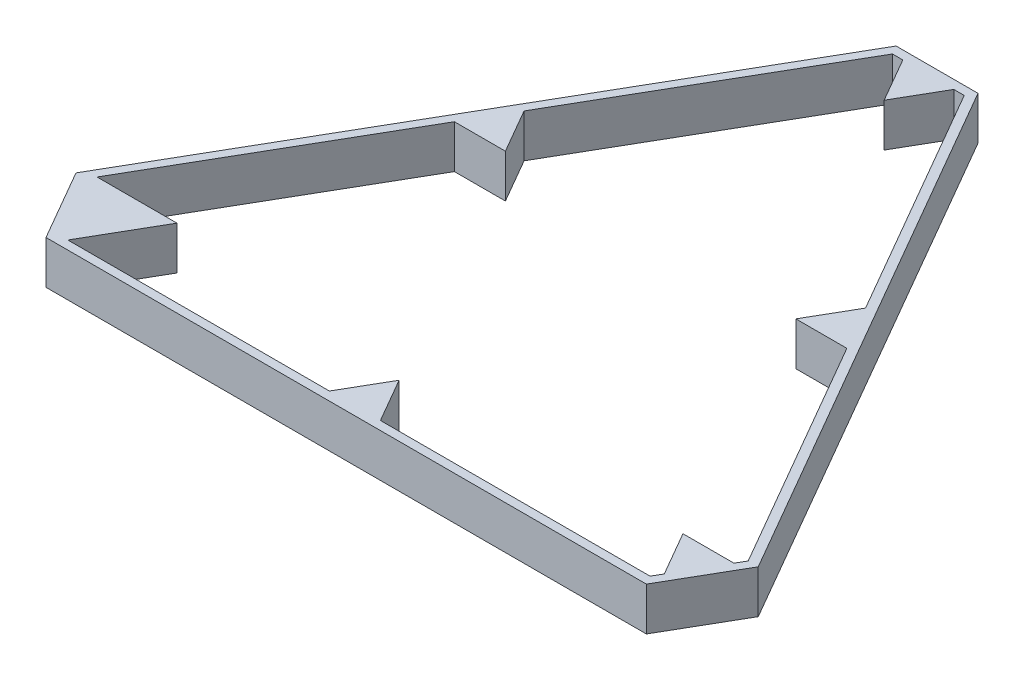
ISO-10303-21;
HEADER;
FILE_DESCRIPTION(('STEP AP214'),'2;1');
FILE_NAME('part.step','',(''),(''),'','','');
FILE_SCHEMA(('AUTOMOTIVE_DESIGN { 1 0 10303 214 1 1 1 1 }'));
ENDSEC;
DATA;
#1=APPLICATION_CONTEXT('core data for automotive mechanical design processes');
#2=APPLICATION_PROTOCOL_DEFINITION('international standard','automotive_design',2000,#1);
#3=PRODUCT_CONTEXT('',#1,'mechanical');
#4=PRODUCT('Part','Part','',(#3));
#5=PRODUCT_RELATED_PRODUCT_CATEGORY('part','',(#4));
#6=PRODUCT_DEFINITION_FORMATION('','',#4);
#7=PRODUCT_DEFINITION_CONTEXT('part definition',#1,'design');
#8=PRODUCT_DEFINITION('design','',#6,#7);
#9=PRODUCT_DEFINITION_SHAPE('','',#8);
#10=(LENGTH_UNIT() NAMED_UNIT(*) SI_UNIT(.MILLI.,.METRE.));
#11=(NAMED_UNIT(*) PLANE_ANGLE_UNIT() SI_UNIT($,.RADIAN.));
#12=(NAMED_UNIT(*) SI_UNIT($,.STERADIAN.) SOLID_ANGLE_UNIT());
#13=UNCERTAINTY_MEASURE_WITH_UNIT(LENGTH_MEASURE(1.E-05),#10,'distance_accuracy_value','');
#14=(GEOMETRIC_REPRESENTATION_CONTEXT(3) GLOBAL_UNCERTAINTY_ASSIGNED_CONTEXT((#13)) GLOBAL_UNIT_ASSIGNED_CONTEXT((#10,
#11,#12)) REPRESENTATION_CONTEXT('',''));
#15=CARTESIAN_POINT('',(0.,0.,0.));
#16=DIRECTION('',(0.,0.,1.));
#17=DIRECTION('',(1.,0.,0.));
#18=AXIS2_PLACEMENT_3D('',#15,#16,#17);
#19=CARTESIAN_POINT('',(-97.7416697506329,12.38,-18.8923048450671));
#20=DIRECTION('',(0.866025403784439,0.,-0.5));
#21=DIRECTION('',(-0.5,0.,-0.866025403784439));
#22=AXIS2_PLACEMENT_3D('',#19,#20,#21);
#23=PLANE('',#22);
#24=DIRECTION('',(0.5,0.,0.866025403784439));
#25=VECTOR('',#24,1.);
#26=CARTESIAN_POINT('',(-97.7416697506329,0.,-18.8923048450671));
#27=LINE('',#26,#25);
#28=CARTESIAN_POINT('',(-97.7416697506329,0.,-18.8923048450671));
#29=VERTEX_POINT('',#28);
#30=CARTESIAN_POINT('',(-86.0096189437243,0.,1.42820322947795));
#31=VERTEX_POINT('',#30);
#32=EDGE_CURVE('E435',#29,#31,#27,.T.);
#33=ORIENTED_EDGE('',*,*,#32,.T.);
#34=DIRECTION('',(0.,-1.,0.));
#35=VECTOR('',#34,1.);
#36=CARTESIAN_POINT('',(-86.0096189437243,12.38,1.42820322947795));
#37=LINE('',#36,#35);
#38=CARTESIAN_POINT('',(-86.0096189437243,12.38,1.42820322947795));
#39=VERTEX_POINT('',#38);
#40=EDGE_CURVE('E12',#39,#31,#37,.T.);
#41=ORIENTED_EDGE('',*,*,#40,.F.);
#42=DIRECTION('',(0.5,0.,0.866025403784439));
#43=VECTOR('',#42,1.);
#44=CARTESIAN_POINT('',(-97.7416697506329,12.38,-18.8923048450671));
#45=LINE('',#44,#43);
#46=CARTESIAN_POINT('',(-97.7416697506329,12.38,-18.8923048450671));
#47=VERTEX_POINT('',#46);
#48=EDGE_CURVE('E475',#47,#39,#45,.T.);
#49=ORIENTED_EDGE('',*,*,#48,.F.);
#50=DIRECTION('',(0.,-1.,0.));
#51=VECTOR('',#50,1.);
#52=CARTESIAN_POINT('',(-97.7416697506329,12.38,-18.8923048450671));
#53=LINE('',#52,#51);
#54=EDGE_CURVE('E492',#47,#29,#53,.T.);
#55=ORIENTED_EDGE('',*,*,#54,.T.);
#56=EDGE_LOOP('',(#33,#41,#49,#55));
#57=FACE_BOUND('',#56,.T.);
#58=ADVANCED_FACE('F117',(#57),#23,.F.);
#59=CARTESIAN_POINT('',(-86.0096189437243,12.38,1.42820322947795));
#60=DIRECTION('',(0.,0.,-1.));
#61=DIRECTION('',(-1.,0.,0.));
#62=AXIS2_PLACEMENT_3D('',#59,#60,#61);
#63=PLANE('',#62);
#64=DIRECTION('',(1.,0.,0.));
#65=VECTOR('',#64,1.);
#66=CARTESIAN_POINT('',(-86.0096189437243,0.,1.42820322947795));
#67=LINE('',#66,#65);
#68=CARTESIAN_POINT('',(86.0096189497081,0.,1.42820322947791));
#69=VERTEX_POINT('',#68);
#70=EDGE_CURVE('E495',#31,#69,#67,.T.);
#71=ORIENTED_EDGE('',*,*,#70,.T.);
#72=DIRECTION('',(0.,-1.,0.));
#73=VECTOR('',#72,1.);
#74=CARTESIAN_POINT('',(86.0096189497081,12.38,1.42820322947791));
#75=LINE('',#74,#73);
#76=CARTESIAN_POINT('',(86.0096189497081,12.38,1.42820322947791));
#77=VERTEX_POINT('',#76);
#78=EDGE_CURVE('E124',#77,#69,#75,.T.);
#79=ORIENTED_EDGE('',*,*,#78,.F.);
#80=DIRECTION('',(1.,0.,0.));
#81=VECTOR('',#80,1.);
#82=CARTESIAN_POINT('',(-86.0096189437243,12.38,1.42820322947795));
#83=LINE('',#82,#81);
#84=EDGE_CURVE('E478',#39,#77,#83,.T.);
#85=ORIENTED_EDGE('',*,*,#84,.F.);
#86=ORIENTED_EDGE('',*,*,#40,.T.);
#87=EDGE_LOOP('',(#71,#79,#85,#86));
#88=FACE_BOUND('',#87,.T.);
#89=ADVANCED_FACE('F521',(#88),#63,.F.);
#90=CARTESIAN_POINT('',(97.7416697477462,12.38,-18.8923048500671));
#91=DIRECTION('',(0.866025404001409,0.,0.499999999624197));
#92=DIRECTION('',(0.499999999624197,0.,-0.866025404001409));
#93=AXIS2_PLACEMENT_3D('',#90,#91,#92);
#94=PLANE('',#93);
#95=DIRECTION('',(-0.499999999624197,0.,0.866025404001409));
#96=VECTOR('',#95,1.);
#97=CARTESIAN_POINT('',(97.7416697477462,0.,-18.8923048500671));
#98=LINE('',#97,#96);
#99=CARTESIAN_POINT('',(97.7416697477462,0.,-18.8923048500671));
#100=VERTEX_POINT('',#99);
#101=EDGE_CURVE('E498',#100,#69,#98,.T.);
#102=ORIENTED_EDGE('',*,*,#101,.F.);
#103=DIRECTION('',(0.,-1.,0.));
#104=VECTOR('',#103,1.);
#105=CARTESIAN_POINT('',(97.7416697477462,12.38,-18.8923048500671));
#106=LINE('',#105,#104);
#107=CARTESIAN_POINT('',(97.7416697477462,12.38,-18.8923048500671));
#108=VERTEX_POINT('',#107);
#109=EDGE_CURVE('E514',#108,#100,#106,.T.);
#110=ORIENTED_EDGE('',*,*,#109,.F.);
#111=DIRECTION('',(-0.499999999624197,0.,0.866025404001409));
#112=VECTOR('',#111,1.);
#113=CARTESIAN_POINT('',(97.7416697477462,12.38,-18.8923048500671));
#114=LINE('',#113,#112);
#115=EDGE_CURVE('E481',#108,#77,#114,.T.);
#116=ORIENTED_EDGE('',*,*,#115,.T.);
#117=ORIENTED_EDGE('',*,*,#78,.T.);
#118=EDGE_LOOP('',(#102,#110,#116,#117));
#119=FACE_BOUND('',#118,.T.);
#120=ADVANCED_FACE('F518',(#119),#94,.T.);
#121=CARTESIAN_POINT('',(97.7416697477462,12.38,-18.8923048500671));
#122=DIRECTION('',(-0.86602540378444,0.,0.499999999999998));
#123=DIRECTION('',(0.499999999999998,0.,0.86602540378444));
#124=AXIS2_PLACEMENT_3D('',#121,#122,#123);
#125=PLANE('',#124);
#126=DIRECTION('',(-0.499999999999998,0.,-0.86602540378444));
#127=VECTOR('',#126,1.);
#128=CARTESIAN_POINT('',(97.7416697477462,0.,-18.8923048500671));
#129=LINE('',#128,#127);
#130=CARTESIAN_POINT('',(11.7320508029588,0.,-167.865334802078));
#131=VERTEX_POINT('',#130);
#132=EDGE_CURVE('E501',#100,#131,#129,.T.);
#133=ORIENTED_EDGE('',*,*,#132,.T.);
#134=DIRECTION('',(0.,-1.,0.));
#135=VECTOR('',#134,1.);
#136=CARTESIAN_POINT('',(11.7320508029588,12.38,-167.865334802078));
#137=LINE('',#136,#135);
#138=CARTESIAN_POINT('',(11.7320508029588,12.38,-167.865334802078));
#139=VERTEX_POINT('',#138);
#140=EDGE_CURVE('E512',#139,#131,#137,.T.);
#141=ORIENTED_EDGE('',*,*,#140,.F.);
#142=DIRECTION('',(-0.499999999999998,0.,-0.86602540378444));
#143=VECTOR('',#142,1.);
#144=CARTESIAN_POINT('',(97.7416697477462,12.38,-18.8923048500671));
#145=LINE('',#144,#143);
#146=EDGE_CURVE('E484',#108,#139,#145,.T.);
#147=ORIENTED_EDGE('',*,*,#146,.F.);
#148=ORIENTED_EDGE('',*,*,#109,.T.);
#149=EDGE_LOOP('',(#133,#141,#147,#148));
#150=FACE_BOUND('',#149,.T.);
#151=ADVANCED_FACE('F530',(#150),#125,.F.);
#152=CARTESIAN_POINT('',(-11.7320508029585,12.38,-167.865334802078));
#153=DIRECTION('',(0.,0.,-1.));
#154=DIRECTION('',(-1.,0.,0.));
#155=AXIS2_PLACEMENT_3D('',#152,#153,#154);
#156=PLANE('',#155);
#157=DIRECTION('',(1.,0.,0.));
#158=VECTOR('',#157,1.);
#159=CARTESIAN_POINT('',(-11.7320508029585,0.,-167.865334802078));
#160=LINE('',#159,#158);
#161=CARTESIAN_POINT('',(-11.7320508029585,0.,-167.865334802078));
#162=VERTEX_POINT('',#161);
#163=EDGE_CURVE('E504',#162,#131,#160,.T.);
#164=ORIENTED_EDGE('',*,*,#163,.F.);
#165=DIRECTION('',(0.,-1.,0.));
#166=VECTOR('',#165,1.);
#167=CARTESIAN_POINT('',(-11.7320508029585,12.38,-167.865334802078));
#168=LINE('',#167,#166);
#169=CARTESIAN_POINT('',(-11.7320508029585,12.38,-167.865334802078));
#170=VERTEX_POINT('',#169);
#171=EDGE_CURVE('E510',#170,#162,#168,.T.);
#172=ORIENTED_EDGE('',*,*,#171,.F.);
#173=DIRECTION('',(1.,0.,0.));
#174=VECTOR('',#173,1.);
#175=CARTESIAN_POINT('',(-11.7320508029585,12.38,-167.865334802078));
#176=LINE('',#175,#174);
#177=EDGE_CURVE('E486',#170,#139,#176,.T.);
#178=ORIENTED_EDGE('',*,*,#177,.T.);
#179=ORIENTED_EDGE('',*,*,#140,.T.);
#180=EDGE_LOOP('',(#164,#172,#178,#179));
#181=FACE_BOUND('',#180,.T.);
#182=ADVANCED_FACE('F540',(#181),#156,.T.);
#183=CARTESIAN_POINT('',(-97.7416697506329,12.38,-18.8923048450671));
#184=DIRECTION('',(-0.866025403784439,0.,-0.5));
#185=DIRECTION('',(-0.5,0.,0.866025403784439));
#186=AXIS2_PLACEMENT_3D('',#183,#184,#185);
#187=PLANE('',#186);
#188=DIRECTION('',(0.5,0.,-0.866025403784439));
#189=VECTOR('',#188,1.);
#190=CARTESIAN_POINT('',(-97.7416697506329,0.,-18.8923048450671));
#191=LINE('',#190,#189);
#192=EDGE_CURVE('E479',#29,#162,#191,.T.);
#193=ORIENTED_EDGE('',*,*,#192,.F.);
#194=ORIENTED_EDGE('',*,*,#54,.F.);
#195=DIRECTION('',(0.5,0.,-0.866025403784439));
#196=VECTOR('',#195,1.);
#197=CARTESIAN_POINT('',(-97.7416697506329,12.38,-18.8923048450671));
#198=LINE('',#197,#196);
#199=EDGE_CURVE('E489',#47,#170,#198,.T.);
#200=ORIENTED_EDGE('',*,*,#199,.T.);
#201=ORIENTED_EDGE('',*,*,#171,.T.);
#202=EDGE_LOOP('',(#193,#194,#200,#201));
#203=FACE_BOUND('',#202,.T.);
#204=ADVANCED_FACE('F538',(#203),#187,.T.);
#205=CARTESIAN_POINT('',(0.,12.38,0.));
#206=DIRECTION('',(0.,1.,0.));
#207=DIRECTION('',(0.,0.,1.));
#208=AXIS2_PLACEMENT_3D('',#205,#206,#207);
#209=PLANE('',#208);
#210=DIRECTION('',(-1.,0.,0.));
#211=VECTOR('',#210,1.);
#212=CARTESIAN_POINT('',(-70.8134665192567,12.38,-20.8923048492323));
#213=LINE('',#212,#211);
#214=CARTESIAN_POINT('',(-70.8134665192567,12.38,-20.8923048492323));
#215=VERTEX_POINT('',#214);
#216=CARTESIAN_POINT('',(-93.7002178395821,12.38,-20.8923048492323));
#217=VERTEX_POINT('',#216);
#218=EDGE_CURVE('E303',#215,#217,#213,.T.);
#219=ORIENTED_EDGE('',*,*,#218,.T.);
#220=DIRECTION('',(0.5,0.,-0.866025403784439));
#221=VECTOR('',#220,1.);
#222=CARTESIAN_POINT('',(-93.7002178395821,12.38,-20.8923048492323));
#223=LINE('',#222,#221);
#224=CARTESIAN_POINT('',(-56.2264972832898,12.38,-85.7986928013689));
#225=VERTEX_POINT('',#224);
#226=EDGE_CURVE('E309',#217,#225,#223,.T.);
#227=ORIENTED_EDGE('',*,*,#226,.T.);
#228=DIRECTION('',(-1.,0.,0.));
#229=VECTOR('',#228,1.);
#230=CARTESIAN_POINT('',(-41.6076951297721,12.38,-85.7986928013689));
#231=LINE('',#230,#229);
#232=CARTESIAN_POINT('',(-41.6076951297721,12.38,-85.7986928013689));
#233=VERTEX_POINT('',#232);
#234=EDGE_CURVE('E313',#233,#225,#231,.T.);
#235=ORIENTED_EDGE('',*,*,#234,.F.);
#236=DIRECTION('',(-0.499999999999996,0.,-0.866025403784441));
#237=VECTOR('',#236,1.);
#238=CARTESIAN_POINT('',(-41.6076951297721,12.38,-85.7986928013689));
#239=LINE('',#238,#237);
#240=CARTESIAN_POINT('',(-48.917096206531,12.38,-98.4589468392141));
#241=VERTEX_POINT('',#240);
#242=EDGE_CURVE('E325',#233,#241,#239,.T.);
#243=ORIENTED_EDGE('',*,*,#242,.T.);
#244=DIRECTION('',(0.500000000000004,0.,-0.866025403784436));
#245=VECTOR('',#244,1.);
#246=CARTESIAN_POINT('',(-48.917096206531,12.38,-98.4589468392141));
#247=LINE('',#246,#245);
#248=CARTESIAN_POINT('',(-10.2886751117216,12.38,-165.365334791589));
#249=VERTEX_POINT('',#248);
#250=EDGE_CURVE('E328',#241,#249,#247,.T.);
#251=ORIENTED_EDGE('',*,*,#250,.T.);
#252=DIRECTION('',(1.,0.,0.));
#253=VECTOR('',#252,1.);
#254=CARTESIAN_POINT('',(-10.2886751117216,12.38,-165.365334791589));
#255=LINE('',#254,#253);
#256=CARTESIAN_POINT('',(-7.30940107673814,12.38,-165.365334791589));
#257=VERTEX_POINT('',#256);
#258=EDGE_CURVE('E331',#249,#257,#255,.T.);
#259=ORIENTED_EDGE('',*,*,#258,.T.);
#260=DIRECTION('',(-0.5,0.,-0.866025403784438));
#261=VECTOR('',#260,1.);
#262=CARTESIAN_POINT('',(2.71895316648585E-11,12.38,-152.705080753732));
#263=LINE('',#262,#261);
#264=CARTESIAN_POINT('',(2.71895316648585E-11,12.38,-152.705080753732));
#265=VERTEX_POINT('',#264);
#266=EDGE_CURVE('E334',#265,#257,#263,.T.);
#267=ORIENTED_EDGE('',*,*,#266,.F.);
#268=DIRECTION('',(0.500000000000003,0.,-0.866025403784437));
#269=VECTOR('',#268,1.);
#270=CARTESIAN_POINT('',(2.71895316648585E-11,12.38,-152.705080753732));
#271=LINE('',#270,#269);
#272=CARTESIAN_POINT('',(7.30940107679511,12.38,-165.365334791593));
#273=VERTEX_POINT('',#272);
#274=EDGE_CURVE('E336',#265,#273,#271,.T.);
#275=ORIENTED_EDGE('',*,*,#274,.T.);
#276=DIRECTION('',(1.,0.,0.));
#277=VECTOR('',#276,1.);
#278=CARTESIAN_POINT('',(7.30940107679511,12.38,-165.365334791593));
#279=LINE('',#278,#277);
#280=CARTESIAN_POINT('',(10.2886751415889,12.38,-165.365334791593));
#281=VERTEX_POINT('',#280);
#282=EDGE_CURVE('E339',#273,#281,#279,.T.);
#283=ORIENTED_EDGE('',*,*,#282,.T.);
#284=DIRECTION('',(-0.5,0.,-0.866025403784439));
#285=VECTOR('',#284,1.);
#286=CARTESIAN_POINT('',(48.9170962396048,12.38,-98.4589468336639));
#287=LINE('',#286,#285);
#288=CARTESIAN_POINT('',(48.9170962396048,12.38,-98.4589468336639));
#289=VERTEX_POINT('',#288);
#290=EDGE_CURVE('E342',#289,#281,#287,.T.);
#291=ORIENTED_EDGE('',*,*,#290,.F.);
#292=DIRECTION('',(0.500000000000019,0.,-0.866025403784428));
#293=VECTOR('',#292,1.);
#294=CARTESIAN_POINT('',(41.6076951628512,12.38,-85.7986927958286));
#295=LINE('',#294,#293);
#296=CARTESIAN_POINT('',(41.6076951628512,12.38,-85.7986927958286));
#297=VERTEX_POINT('',#296);
#298=EDGE_CURVE('E344',#297,#289,#295,.T.);
#299=ORIENTED_EDGE('',*,*,#298,.F.);
#300=DIRECTION('',(1.,0.,0.));
#301=VECTOR('',#300,1.);
#302=CARTESIAN_POINT('',(41.6076951628512,12.38,-85.7986927958286));
#303=LINE('',#302,#301);
#304=CARTESIAN_POINT('',(56.226497316358,12.38,-85.7986927958286));
#305=VERTEX_POINT('',#304);
#306=EDGE_CURVE('E346',#297,#305,#303,.T.);
#307=ORIENTED_EDGE('',*,*,#306,.T.);
#308=DIRECTION('',(0.5,0.,0.866025403784439));
#309=VECTOR('',#308,1.);
#310=CARTESIAN_POINT('',(56.226497316358,12.38,-85.7986927958286));
#311=LINE('',#310,#309);
#312=CARTESIAN_POINT('',(94.8549184123629,12.38,-18.8923048413828));
#313=VERTEX_POINT('',#312);
#314=EDGE_CURVE('E349',#305,#313,#311,.T.);
#315=ORIENTED_EDGE('',*,*,#314,.T.);
#316=DIRECTION('',(-0.499999999967773,0.,0.866025403803045));
#317=VECTOR('',#316,1.);
#318=CARTESIAN_POINT('',(94.8549184123629,12.38,-18.8923048413828));
#319=LINE('',#318,#317);
#320=CARTESIAN_POINT('',(93.3652813904102,12.38,-16.3121778343035));
#321=VERTEX_POINT('',#320);
#322=EDGE_CURVE('E352',#313,#321,#319,.T.);
#323=ORIENTED_EDGE('',*,*,#322,.T.);
#324=DIRECTION('',(1.,0.,0.));
#325=VECTOR('',#324,1.);
#326=CARTESIAN_POINT('',(78.7464792329573,12.38,-16.3121778343025));
#327=LINE('',#326,#325);
#328=CARTESIAN_POINT('',(78.7464792329573,12.38,-16.3121778343025));
#329=VERTEX_POINT('',#328);
#330=EDGE_CURVE('E355',#329,#321,#327,.T.);
#331=ORIENTED_EDGE('',*,*,#330,.F.);
#332=DIRECTION('',(0.500000000000109,0.,0.866025403784376));
#333=VECTOR('',#332,1.);
#334=CARTESIAN_POINT('',(78.7464792329573,12.38,-16.3121778343025));
#335=LINE('',#334,#333);
#336=CARTESIAN_POINT('',(86.0558803116491,12.38,-3.65192379311334));
#337=VERTEX_POINT('',#336);
#338=EDGE_CURVE('E357',#329,#337,#335,.T.);
#339=ORIENTED_EDGE('',*,*,#338,.T.);
#340=DIRECTION('',(-0.499999999999997,0.,0.866025403784441));
#341=VECTOR('',#340,1.);
#342=CARTESIAN_POINT('',(86.0558803116491,12.38,-3.65192379311334));
#343=LINE('',#342,#341);
#344=CARTESIAN_POINT('',(84.5662432934613,12.38,-1.07179679277666));
#345=VERTEX_POINT('',#344);
#346=EDGE_CURVE('E360',#337,#345,#343,.T.);
#347=ORIENTED_EDGE('',*,*,#346,.T.);
#348=DIRECTION('',(-1.,0.,0.));
#349=VECTOR('',#348,1.);
#350=CARTESIAN_POINT('',(84.5662432934613,12.38,-1.07179679277666));
#351=LINE('',#350,#349);
#352=CARTESIAN_POINT('',(7.30940108838969,12.38,-1.07179679277635));
#353=VERTEX_POINT('',#352);
#354=EDGE_CURVE('E363',#345,#353,#351,.T.);
#355=ORIENTED_EDGE('',*,*,#354,.T.);
#356=DIRECTION('',(0.499999999999996,0.,0.866025403784441));
#357=VECTOR('',#356,1.);
#358=CARTESIAN_POINT('',(1.96086398346691E-09,12.38,-13.7320508473704));
#359=LINE('',#358,#357);
#360=CARTESIAN_POINT('',(1.96086398346691E-09,12.38,-13.7320508473704));
#361=VERTEX_POINT('',#360);
#362=EDGE_CURVE('E366',#361,#353,#359,.T.);
#363=ORIENTED_EDGE('',*,*,#362,.F.);
#364=DIRECTION('',(-0.499999999990651,0.,0.866025403789837));
#365=VECTOR('',#364,1.);
#366=CARTESIAN_POINT('',(1.96086398346691E-09,12.38,-13.7320508473704));
#367=LINE('',#366,#365);
#368=CARTESIAN_POINT('',(-7.30940108257845,12.38,-1.07179679573359));
#369=VERTEX_POINT('',#368);
#370=EDGE_CURVE('E368',#361,#369,#367,.T.);
#371=ORIENTED_EDGE('',*,*,#370,.T.);
#372=DIRECTION('',(1.,0.,0.));
#373=VECTOR('',#372,1.);
#374=CARTESIAN_POINT('',(-82.2568421794194,12.38,-1.07179679573359));
#375=LINE('',#374,#373);
#376=CARTESIAN_POINT('',(-82.2568421794194,12.38,-1.07179679573359));
#377=VERTEX_POINT('',#376);
#378=EDGE_CURVE('E371',#377,#369,#375,.T.);
#379=ORIENTED_EDGE('',*,*,#378,.F.);
#380=DIRECTION('',(-0.5,0.,0.866025403784439));
#381=VECTOR('',#380,1.);
#382=CARTESIAN_POINT('',(-70.8134665192567,12.38,-20.8923048492323));
#383=LINE('',#382,#381);
#384=EDGE_CURVE('E306',#215,#377,#383,.T.);
#385=ORIENTED_EDGE('',*,*,#384,.F.);
#386=EDGE_LOOP('',(#219,#227,#235,#243,#251,#259,#267,#275,#283,#291,#299,#307,#315,#323,#331,
#339,#347,#355,#363,#371,#379,#385));
#387=FACE_BOUND('',#386,.T.);
#388=ORIENTED_EDGE('',*,*,#48,.T.);
#389=ORIENTED_EDGE('',*,*,#84,.T.);
#390=ORIENTED_EDGE('',*,*,#115,.F.);
#391=ORIENTED_EDGE('',*,*,#146,.T.);
#392=ORIENTED_EDGE('',*,*,#177,.F.);
#393=ORIENTED_EDGE('',*,*,#199,.F.);
#394=EDGE_LOOP('',(#388,#389,#390,#391,#392,#393));
#395=FACE_BOUND('',#394,.T.);
#396=ADVANCED_FACE('F315',(#387,#395),#209,.T.);
#397=CARTESIAN_POINT('',(0.,0.,0.));
#398=DIRECTION('',(0.,1.,0.));
#399=DIRECTION('',(0.,0.,1.));
#400=AXIS2_PLACEMENT_3D('',#397,#398,#399);
#401=PLANE('',#400);
#402=DIRECTION('',(0.5,0.,-0.866025403784439));
#403=VECTOR('',#402,1.);
#404=CARTESIAN_POINT('',(-93.7002178395821,0.,-20.8923048492323));
#405=LINE('',#404,#403);
#406=CARTESIAN_POINT('',(-93.7002178395821,0.,-20.8923048492323));
#407=VERTEX_POINT('',#406);
#408=CARTESIAN_POINT('',(-56.2264972832898,0.,-85.7986928013689));
#409=VERTEX_POINT('',#408);
#410=EDGE_CURVE('E375',#407,#409,#405,.T.);
#411=ORIENTED_EDGE('',*,*,#410,.F.);
#412=DIRECTION('',(-1.,0.,0.));
#413=VECTOR('',#412,1.);
#414=CARTESIAN_POINT('',(-70.8134665192567,0.,-20.8923048492323));
#415=LINE('',#414,#413);
#416=CARTESIAN_POINT('',(-70.8134665192567,0.,-20.8923048492323));
#417=VERTEX_POINT('',#416);
#418=EDGE_CURVE('E139',#417,#407,#415,.T.);
#419=ORIENTED_EDGE('',*,*,#418,.F.);
#420=DIRECTION('',(-0.5,0.,0.866025403784439));
#421=VECTOR('',#420,1.);
#422=CARTESIAN_POINT('',(-70.8134665192567,0.,-20.8923048492323));
#423=LINE('',#422,#421);
#424=CARTESIAN_POINT('',(-82.2568421794194,0.,-1.07179679573359));
#425=VERTEX_POINT('',#424);
#426=EDGE_CURVE('E318',#417,#425,#423,.T.);
#427=ORIENTED_EDGE('',*,*,#426,.T.);
#428=DIRECTION('',(1.,0.,0.));
#429=VECTOR('',#428,1.);
#430=CARTESIAN_POINT('',(-82.2568421794194,0.,-1.07179679573359));
#431=LINE('',#430,#429);
#432=CARTESIAN_POINT('',(-7.30940108257845,0.,-1.07179679573359));
#433=VERTEX_POINT('',#432);
#434=EDGE_CURVE('E321',#425,#433,#431,.T.);
#435=ORIENTED_EDGE('',*,*,#434,.T.);
#436=DIRECTION('',(-0.499999999990651,0.,0.866025403789837));
#437=VECTOR('',#436,1.);
#438=CARTESIAN_POINT('',(1.96086398346691E-09,0.,-13.7320508473704));
#439=LINE('',#438,#437);
#440=CARTESIAN_POINT('',(1.96086398346691E-09,0.,-13.7320508473704));
#441=VERTEX_POINT('',#440);
#442=EDGE_CURVE('E428',#441,#433,#439,.T.);
#443=ORIENTED_EDGE('',*,*,#442,.F.);
#444=DIRECTION('',(0.499999999999996,0.,0.866025403784441));
#445=VECTOR('',#444,1.);
#446=CARTESIAN_POINT('',(1.96086398346691E-09,0.,-13.7320508473704));
#447=LINE('',#446,#445);
#448=CARTESIAN_POINT('',(7.30940108838969,0.,-1.07179679277635));
#449=VERTEX_POINT('',#448);
#450=EDGE_CURVE('E425',#441,#449,#447,.T.);
#451=ORIENTED_EDGE('',*,*,#450,.T.);
#452=DIRECTION('',(-1.,0.,0.));
#453=VECTOR('',#452,1.);
#454=CARTESIAN_POINT('',(84.5662432934613,0.,-1.07179679277666));
#455=LINE('',#454,#453);
#456=CARTESIAN_POINT('',(84.5662432934613,0.,-1.07179679277666));
#457=VERTEX_POINT('',#456);
#458=EDGE_CURVE('E422',#457,#449,#455,.T.);
#459=ORIENTED_EDGE('',*,*,#458,.F.);
#460=DIRECTION('',(-0.499999999999997,0.,0.866025403784441));
#461=VECTOR('',#460,1.);
#462=CARTESIAN_POINT('',(86.0558803116491,0.,-3.65192379311334));
#463=LINE('',#462,#461);
#464=CARTESIAN_POINT('',(86.0558803116491,0.,-3.65192379311334));
#465=VERTEX_POINT('',#464);
#466=EDGE_CURVE('E419',#465,#457,#463,.T.);
#467=ORIENTED_EDGE('',*,*,#466,.F.);
#468=DIRECTION('',(0.500000000000109,0.,0.866025403784376));
#469=VECTOR('',#468,1.);
#470=CARTESIAN_POINT('',(78.7464792329573,0.,-16.3121778343025));
#471=LINE('',#470,#469);
#472=CARTESIAN_POINT('',(78.7464792329573,0.,-16.3121778343025));
#473=VERTEX_POINT('',#472);
#474=EDGE_CURVE('E416',#473,#465,#471,.T.);
#475=ORIENTED_EDGE('',*,*,#474,.F.);
#476=DIRECTION('',(1.,0.,0.));
#477=VECTOR('',#476,1.);
#478=CARTESIAN_POINT('',(78.7464792329573,0.,-16.3121778343025));
#479=LINE('',#478,#477);
#480=CARTESIAN_POINT('',(93.3652813904102,0.,-16.3121778343035));
#481=VERTEX_POINT('',#480);
#482=EDGE_CURVE('E413',#473,#481,#479,.T.);
#483=ORIENTED_EDGE('',*,*,#482,.T.);
#484=DIRECTION('',(-0.499999999967773,0.,0.866025403803045));
#485=VECTOR('',#484,1.);
#486=CARTESIAN_POINT('',(94.8549184123629,0.,-18.8923048413828));
#487=LINE('',#486,#485);
#488=CARTESIAN_POINT('',(94.8549184123629,0.,-18.8923048413828));
#489=VERTEX_POINT('',#488);
#490=EDGE_CURVE('E410',#489,#481,#487,.T.);
#491=ORIENTED_EDGE('',*,*,#490,.F.);
#492=DIRECTION('',(0.5,0.,0.866025403784439));
#493=VECTOR('',#492,1.);
#494=CARTESIAN_POINT('',(56.226497316358,0.,-85.7986927958286));
#495=LINE('',#494,#493);
#496=CARTESIAN_POINT('',(56.226497316358,0.,-85.7986927958286));
#497=VERTEX_POINT('',#496);
#498=EDGE_CURVE('E407',#497,#489,#495,.T.);
#499=ORIENTED_EDGE('',*,*,#498,.F.);
#500=DIRECTION('',(1.,0.,0.));
#501=VECTOR('',#500,1.);
#502=CARTESIAN_POINT('',(41.6076951628512,0.,-85.7986927958286));
#503=LINE('',#502,#501);
#504=CARTESIAN_POINT('',(41.6076951628512,0.,-85.7986927958286));
#505=VERTEX_POINT('',#504);
#506=EDGE_CURVE('E404',#505,#497,#503,.T.);
#507=ORIENTED_EDGE('',*,*,#506,.F.);
#508=DIRECTION('',(0.500000000000019,0.,-0.866025403784428));
#509=VECTOR('',#508,1.);
#510=CARTESIAN_POINT('',(41.6076951628512,0.,-85.7986927958286));
#511=LINE('',#510,#509);
#512=CARTESIAN_POINT('',(48.9170962396048,0.,-98.4589468336639));
#513=VERTEX_POINT('',#512);
#514=EDGE_CURVE('E401',#505,#513,#511,.T.);
#515=ORIENTED_EDGE('',*,*,#514,.T.);
#516=DIRECTION('',(-0.5,0.,-0.866025403784439));
#517=VECTOR('',#516,1.);
#518=CARTESIAN_POINT('',(48.9170962396048,0.,-98.4589468336639));
#519=LINE('',#518,#517);
#520=CARTESIAN_POINT('',(10.2886751415889,0.,-165.365334791593));
#521=VERTEX_POINT('',#520);
#522=EDGE_CURVE('E398',#513,#521,#519,.T.);
#523=ORIENTED_EDGE('',*,*,#522,.T.);
#524=DIRECTION('',(1.,0.,0.));
#525=VECTOR('',#524,1.);
#526=CARTESIAN_POINT('',(7.30940107679511,0.,-165.365334791593));
#527=LINE('',#526,#525);
#528=CARTESIAN_POINT('',(7.30940107679511,0.,-165.365334791593));
#529=VERTEX_POINT('',#528);
#530=EDGE_CURVE('E395',#529,#521,#527,.T.);
#531=ORIENTED_EDGE('',*,*,#530,.F.);
#532=DIRECTION('',(0.500000000000003,0.,-0.866025403784437));
#533=VECTOR('',#532,1.);
#534=CARTESIAN_POINT('',(2.71895316648585E-11,0.,-152.705080753732));
#535=LINE('',#534,#533);
#536=CARTESIAN_POINT('',(2.71895316648585E-11,0.,-152.705080753732));
#537=VERTEX_POINT('',#536);
#538=EDGE_CURVE('E392',#537,#529,#535,.T.);
#539=ORIENTED_EDGE('',*,*,#538,.F.);
#540=DIRECTION('',(-0.5,0.,-0.866025403784438));
#541=VECTOR('',#540,1.);
#542=CARTESIAN_POINT('',(2.71895316648585E-11,0.,-152.705080753732));
#543=LINE('',#542,#541);
#544=CARTESIAN_POINT('',(-7.30940107673814,0.,-165.365334791589));
#545=VERTEX_POINT('',#544);
#546=EDGE_CURVE('E389',#537,#545,#543,.T.);
#547=ORIENTED_EDGE('',*,*,#546,.T.);
#548=DIRECTION('',(1.,0.,0.));
#549=VECTOR('',#548,1.);
#550=CARTESIAN_POINT('',(-10.2886751117216,0.,-165.365334791589));
#551=LINE('',#550,#549);
#552=CARTESIAN_POINT('',(-10.2886751117216,0.,-165.365334791589));
#553=VERTEX_POINT('',#552);
#554=EDGE_CURVE('E386',#553,#545,#551,.T.);
#555=ORIENTED_EDGE('',*,*,#554,.F.);
#556=DIRECTION('',(0.500000000000004,0.,-0.866025403784436));
#557=VECTOR('',#556,1.);
#558=CARTESIAN_POINT('',(-48.917096206531,0.,-98.4589468392141));
#559=LINE('',#558,#557);
#560=CARTESIAN_POINT('',(-48.917096206531,0.,-98.4589468392141));
#561=VERTEX_POINT('',#560);
#562=EDGE_CURVE('E383',#561,#553,#559,.T.);
#563=ORIENTED_EDGE('',*,*,#562,.F.);
#564=DIRECTION('',(-0.499999999999996,0.,-0.866025403784441));
#565=VECTOR('',#564,1.);
#566=CARTESIAN_POINT('',(-41.6076951297721,0.,-85.7986928013689));
#567=LINE('',#566,#565);
#568=CARTESIAN_POINT('',(-41.6076951297721,0.,-85.7986928013689));
#569=VERTEX_POINT('',#568);
#570=EDGE_CURVE('E380',#569,#561,#567,.T.);
#571=ORIENTED_EDGE('',*,*,#570,.F.);
#572=DIRECTION('',(-1.,0.,0.));
#573=VECTOR('',#572,1.);
#574=CARTESIAN_POINT('',(-41.6076951297721,0.,-85.7986928013689));
#575=LINE('',#574,#573);
#576=EDGE_CURVE('E377',#569,#409,#575,.T.);
#577=ORIENTED_EDGE('',*,*,#576,.T.);
#578=EDGE_LOOP('',(#411,#419,#427,#435,#443,#451,#459,#467,#475,#483,#491,#499,#507,#515,#523,
#531,#539,#547,#555,#563,#571,#577));
#579=FACE_BOUND('',#578,.T.);
#580=ORIENTED_EDGE('',*,*,#32,.F.);
#581=ORIENTED_EDGE('',*,*,#192,.T.);
#582=ORIENTED_EDGE('',*,*,#163,.T.);
#583=ORIENTED_EDGE('',*,*,#132,.F.);
#584=ORIENTED_EDGE('',*,*,#101,.T.);
#585=ORIENTED_EDGE('',*,*,#70,.F.);
#586=EDGE_LOOP('',(#580,#581,#582,#583,#584,#585));
#587=FACE_BOUND('',#586,.T.);
#588=ADVANCED_FACE('F526',(#579,#587),#401,.F.);
#589=CARTESIAN_POINT('',(-70.8134665192567,12.38,-20.8923048492323));
#590=DIRECTION('',(0.,0.,1.));
#591=DIRECTION('',(1.,0.,0.));
#592=AXIS2_PLACEMENT_3D('',#589,#590,#591);
#593=PLANE('',#592);
#594=ORIENTED_EDGE('',*,*,#418,.T.);
#595=DIRECTION('',(0.,-1.,0.));
#596=VECTOR('',#595,1.);
#597=CARTESIAN_POINT('',(-93.7002178395821,12.38,-20.8923048492323));
#598=LINE('',#597,#596);
#599=EDGE_CURVE('E300',#217,#407,#598,.T.);
#600=ORIENTED_EDGE('',*,*,#599,.F.);
#601=ORIENTED_EDGE('',*,*,#218,.F.);
#602=DIRECTION('',(0.,-1.,0.));
#603=VECTOR('',#602,1.);
#604=CARTESIAN_POINT('',(-70.8134665192567,12.38,-20.8923048492323));
#605=LINE('',#604,#603);
#606=EDGE_CURVE('E433',#215,#417,#605,.T.);
#607=ORIENTED_EDGE('',*,*,#606,.T.);
#608=EDGE_LOOP('',(#594,#600,#601,#607));
#609=FACE_BOUND('',#608,.T.);
#610=ADVANCED_FACE('F301',(#609),#593,.F.);
#611=CARTESIAN_POINT('',(-70.8134665192567,12.38,-20.8923048492323));
#612=DIRECTION('',(0.866025403784439,0.,0.5));
#613=DIRECTION('',(0.5,0.,-0.866025403784439));
#614=AXIS2_PLACEMENT_3D('',#611,#612,#613);
#615=PLANE('',#614);
#616=ORIENTED_EDGE('',*,*,#426,.F.);
#617=ORIENTED_EDGE('',*,*,#606,.F.);
#618=ORIENTED_EDGE('',*,*,#384,.T.);
#619=DIRECTION('',(0.,-1.,0.));
#620=VECTOR('',#619,1.);
#621=CARTESIAN_POINT('',(-82.2568421794194,12.38,-1.07179679573359));
#622=LINE('',#621,#620);
#623=EDGE_CURVE('E436',#377,#425,#622,.T.);
#624=ORIENTED_EDGE('',*,*,#623,.T.);
#625=EDGE_LOOP('',(#616,#617,#618,#624));
#626=FACE_BOUND('',#625,.T.);
#627=ADVANCED_FACE('F599',(#626),#615,.T.);
#628=CARTESIAN_POINT('',(-82.2568421794194,12.38,-1.07179679573359));
#629=DIRECTION('',(0.,0.,-1.));
#630=DIRECTION('',(-1.,0.,0.));
#631=AXIS2_PLACEMENT_3D('',#628,#629,#630);
#632=PLANE('',#631);
#633=ORIENTED_EDGE('',*,*,#434,.F.);
#634=ORIENTED_EDGE('',*,*,#623,.F.);
#635=ORIENTED_EDGE('',*,*,#378,.T.);
#636=DIRECTION('',(0.,-1.,0.));
#637=VECTOR('',#636,1.);
#638=CARTESIAN_POINT('',(-7.30940108257845,12.38,-1.07179679573359));
#639=LINE('',#638,#637);
#640=EDGE_CURVE('E438',#369,#433,#639,.T.);
#641=ORIENTED_EDGE('',*,*,#640,.T.);
#642=EDGE_LOOP('',(#633,#634,#635,#641));
#643=FACE_BOUND('',#642,.T.);
#644=ADVANCED_FACE('F608',(#643),#632,.T.);
#645=CARTESIAN_POINT('',(1.96086398346691E-09,12.38,-13.7320508473704));
#646=DIRECTION('',(0.866025403789836,0.,0.499999999990651));
#647=DIRECTION('',(0.499999999990651,0.,-0.866025403789836));
#648=AXIS2_PLACEMENT_3D('',#645,#646,#647);
#649=PLANE('',#648);
#650=ORIENTED_EDGE('',*,*,#442,.T.);
#651=ORIENTED_EDGE('',*,*,#640,.F.);
#652=ORIENTED_EDGE('',*,*,#370,.F.);
#653=DIRECTION('',(0.,-1.,0.));
#654=VECTOR('',#653,1.);
#655=CARTESIAN_POINT('',(1.96086398346691E-09,12.38,-13.7320508473704));
#656=LINE('',#655,#654);
#657=EDGE_CURVE('E440',#361,#441,#656,.T.);
#658=ORIENTED_EDGE('',*,*,#657,.T.);
#659=EDGE_LOOP('',(#650,#651,#652,#658));
#660=FACE_BOUND('',#659,.T.);
#661=ADVANCED_FACE('F618',(#660),#649,.F.);
#662=CARTESIAN_POINT('',(1.96086398346691E-09,12.38,-13.7320508473704));
#663=DIRECTION('',(0.866025403784441,0.,-0.499999999999996));
#664=DIRECTION('',(-0.499999999999996,0.,-0.866025403784441));
#665=AXIS2_PLACEMENT_3D('',#662,#663,#664);
#666=PLANE('',#665);
#667=ORIENTED_EDGE('',*,*,#450,.F.);
#668=ORIENTED_EDGE('',*,*,#657,.F.);
#669=ORIENTED_EDGE('',*,*,#362,.T.);
#670=DIRECTION('',(0.,-1.,0.));
#671=VECTOR('',#670,1.);
#672=CARTESIAN_POINT('',(7.30940108838969,12.38,-1.07179679277635));
#673=LINE('',#672,#671);
#674=EDGE_CURVE('E442',#353,#449,#673,.T.);
#675=ORIENTED_EDGE('',*,*,#674,.T.);
#676=EDGE_LOOP('',(#667,#668,#669,#675));
#677=FACE_BOUND('',#676,.T.);
#678=ADVANCED_FACE('F628',(#677),#666,.T.);
#679=CARTESIAN_POINT('',(84.5662432934613,12.38,-1.07179679277666));
#680=DIRECTION('',(0.,0.,1.));
#681=DIRECTION('',(1.,0.,0.));
#682=AXIS2_PLACEMENT_3D('',#679,#680,#681);
#683=PLANE('',#682);
#684=ORIENTED_EDGE('',*,*,#458,.T.);
#685=ORIENTED_EDGE('',*,*,#674,.F.);
#686=ORIENTED_EDGE('',*,*,#354,.F.);
#687=DIRECTION('',(0.,-1.,0.));
#688=VECTOR('',#687,1.);
#689=CARTESIAN_POINT('',(84.5662432934613,12.38,-1.07179679277666));
#690=LINE('',#689,#688);
#691=EDGE_CURVE('E444',#345,#457,#690,.T.);
#692=ORIENTED_EDGE('',*,*,#691,.T.);
#693=EDGE_LOOP('',(#684,#685,#686,#692));
#694=FACE_BOUND('',#693,.T.);
#695=ADVANCED_FACE('F638',(#694),#683,.F.);
#696=CARTESIAN_POINT('',(86.0558803116491,12.38,-3.65192379311334));
#697=DIRECTION('',(0.866025403784441,0.,0.499999999999997));
#698=DIRECTION('',(0.499999999999997,0.,-0.866025403784441));
#699=AXIS2_PLACEMENT_3D('',#696,#697,#698);
#700=PLANE('',#699);
#701=ORIENTED_EDGE('',*,*,#466,.T.);
#702=ORIENTED_EDGE('',*,*,#691,.F.);
#703=ORIENTED_EDGE('',*,*,#346,.F.);
#704=DIRECTION('',(0.,-1.,0.));
#705=VECTOR('',#704,1.);
#706=CARTESIAN_POINT('',(86.0558803116491,12.38,-3.65192379311334));
#707=LINE('',#706,#705);
#708=EDGE_CURVE('E446',#337,#465,#707,.T.);
#709=ORIENTED_EDGE('',*,*,#708,.T.);
#710=EDGE_LOOP('',(#701,#702,#703,#709));
#711=FACE_BOUND('',#710,.T.);
#712=ADVANCED_FACE('F648',(#711),#700,.F.);
#713=CARTESIAN_POINT('',(78.7464792329573,12.38,-16.3121778343025));
#714=DIRECTION('',(0.866025403784376,0.,-0.500000000000109));
#715=DIRECTION('',(-0.500000000000109,0.,-0.866025403784376));
#716=AXIS2_PLACEMENT_3D('',#713,#714,#715);
#717=PLANE('',#716);
#718=ORIENTED_EDGE('',*,*,#474,.T.);
#719=ORIENTED_EDGE('',*,*,#708,.F.);
#720=ORIENTED_EDGE('',*,*,#338,.F.);
#721=DIRECTION('',(0.,-1.,0.));
#722=VECTOR('',#721,1.);
#723=CARTESIAN_POINT('',(78.7464792329573,12.38,-16.3121778343025));
#724=LINE('',#723,#722);
#725=EDGE_CURVE('E448',#329,#473,#724,.T.);
#726=ORIENTED_EDGE('',*,*,#725,.T.);
#727=EDGE_LOOP('',(#718,#719,#720,#726));
#728=FACE_BOUND('',#727,.T.);
#729=ADVANCED_FACE('F658',(#728),#717,.F.);
#730=CARTESIAN_POINT('',(78.7464792329573,12.38,-16.3121778343025));
#731=DIRECTION('',(0.,0.,-1.));
#732=DIRECTION('',(-1.,0.,0.));
#733=AXIS2_PLACEMENT_3D('',#730,#731,#732);
#734=PLANE('',#733);
#735=ORIENTED_EDGE('',*,*,#482,.F.);
#736=ORIENTED_EDGE('',*,*,#725,.F.);
#737=ORIENTED_EDGE('',*,*,#330,.T.);
#738=DIRECTION('',(0.,-1.,0.));
#739=VECTOR('',#738,1.);
#740=CARTESIAN_POINT('',(93.3652813904102,12.38,-16.3121778343035));
#741=LINE('',#740,#739);
#742=EDGE_CURVE('E450',#321,#481,#741,.T.);
#743=ORIENTED_EDGE('',*,*,#742,.T.);
#744=EDGE_LOOP('',(#735,#736,#737,#743));
#745=FACE_BOUND('',#744,.T.);
#746=ADVANCED_FACE('F668',(#745),#734,.T.);
#747=CARTESIAN_POINT('',(94.8549184123629,12.38,-18.8923048413828));
#748=DIRECTION('',(0.866025403803045,0.,0.499999999967773));
#749=DIRECTION('',(0.499999999967773,0.,-0.866025403803045));
#750=AXIS2_PLACEMENT_3D('',#747,#748,#749);
#751=PLANE('',#750);
#752=ORIENTED_EDGE('',*,*,#490,.T.);
#753=ORIENTED_EDGE('',*,*,#742,.F.);
#754=ORIENTED_EDGE('',*,*,#322,.F.);
#755=DIRECTION('',(0.,-1.,0.));
#756=VECTOR('',#755,1.);
#757=CARTESIAN_POINT('',(94.8549184123629,12.38,-18.8923048413828));
#758=LINE('',#757,#756);
#759=EDGE_CURVE('E452',#313,#489,#758,.T.);
#760=ORIENTED_EDGE('',*,*,#759,.T.);
#761=EDGE_LOOP('',(#752,#753,#754,#760));
#762=FACE_BOUND('',#761,.T.);
#763=ADVANCED_FACE('F678',(#762),#751,.F.);
#764=CARTESIAN_POINT('',(56.226497316358,12.38,-85.7986927958286));
#765=DIRECTION('',(0.866025403784439,0.,-0.5));
#766=DIRECTION('',(-0.5,0.,-0.866025403784439));
#767=AXIS2_PLACEMENT_3D('',#764,#765,#766);
#768=PLANE('',#767);
#769=ORIENTED_EDGE('',*,*,#498,.T.);
#770=ORIENTED_EDGE('',*,*,#759,.F.);
#771=ORIENTED_EDGE('',*,*,#314,.F.);
#772=DIRECTION('',(0.,-1.,0.));
#773=VECTOR('',#772,1.);
#774=CARTESIAN_POINT('',(56.226497316358,12.38,-85.7986927958286));
#775=LINE('',#774,#773);
#776=EDGE_CURVE('E454',#305,#497,#775,.T.);
#777=ORIENTED_EDGE('',*,*,#776,.T.);
#778=EDGE_LOOP('',(#769,#770,#771,#777));
#779=FACE_BOUND('',#778,.T.);
#780=ADVANCED_FACE('F688',(#779),#768,.F.);
#781=CARTESIAN_POINT('',(41.6076951628512,12.38,-85.7986927958286));
#782=DIRECTION('',(0.,0.,-1.));
#783=DIRECTION('',(-1.,0.,0.));
#784=AXIS2_PLACEMENT_3D('',#781,#782,#783);
#785=PLANE('',#784);
#786=ORIENTED_EDGE('',*,*,#506,.T.);
#787=ORIENTED_EDGE('',*,*,#776,.F.);
#788=ORIENTED_EDGE('',*,*,#306,.F.);
#789=DIRECTION('',(0.,-1.,0.));
#790=VECTOR('',#789,1.);
#791=CARTESIAN_POINT('',(41.6076951628512,12.38,-85.7986927958286));
#792=LINE('',#791,#790);
#793=EDGE_CURVE('E456',#297,#505,#792,.T.);
#794=ORIENTED_EDGE('',*,*,#793,.T.);
#795=EDGE_LOOP('',(#786,#787,#788,#794));
#796=FACE_BOUND('',#795,.T.);
#797=ADVANCED_FACE('F698',(#796),#785,.F.);
#798=CARTESIAN_POINT('',(41.6076951628512,12.38,-85.7986927958286));
#799=DIRECTION('',(-0.866025403784428,0.,-0.500000000000019));
#800=DIRECTION('',(-0.500000000000019,0.,0.866025403784428));
#801=AXIS2_PLACEMENT_3D('',#798,#799,#800);
#802=PLANE('',#801);
#803=ORIENTED_EDGE('',*,*,#514,.F.);
#804=ORIENTED_EDGE('',*,*,#793,.F.);
#805=ORIENTED_EDGE('',*,*,#298,.T.);
#806=DIRECTION('',(0.,-1.,0.));
#807=VECTOR('',#806,1.);
#808=CARTESIAN_POINT('',(48.9170962396048,12.38,-98.4589468336639));
#809=LINE('',#808,#807);
#810=EDGE_CURVE('E458',#289,#513,#809,.T.);
#811=ORIENTED_EDGE('',*,*,#810,.T.);
#812=EDGE_LOOP('',(#803,#804,#805,#811));
#813=FACE_BOUND('',#812,.T.);
#814=ADVANCED_FACE('F708',(#813),#802,.T.);
#815=CARTESIAN_POINT('',(48.9170962396048,12.38,-98.4589468336639));
#816=DIRECTION('',(-0.866025403784439,0.,0.5));
#817=DIRECTION('',(0.5,0.,0.866025403784439));
#818=AXIS2_PLACEMENT_3D('',#815,#816,#817);
#819=PLANE('',#818);
#820=ORIENTED_EDGE('',*,*,#522,.F.);
#821=ORIENTED_EDGE('',*,*,#810,.F.);
#822=ORIENTED_EDGE('',*,*,#290,.T.);
#823=DIRECTION('',(0.,-1.,0.));
#824=VECTOR('',#823,1.);
#825=CARTESIAN_POINT('',(10.2886751415889,12.38,-165.365334791593));
#826=LINE('',#825,#824);
#827=EDGE_CURVE('E460',#281,#521,#826,.T.);
#828=ORIENTED_EDGE('',*,*,#827,.T.);
#829=EDGE_LOOP('',(#820,#821,#822,#828));
#830=FACE_BOUND('',#829,.T.);
#831=ADVANCED_FACE('F718',(#830),#819,.T.);
#832=CARTESIAN_POINT('',(7.30940107679511,12.38,-165.365334791593));
#833=DIRECTION('',(0.,0.,-1.));
#834=DIRECTION('',(-1.,0.,0.));
#835=AXIS2_PLACEMENT_3D('',#832,#833,#834);
#836=PLANE('',#835);
#837=ORIENTED_EDGE('',*,*,#530,.T.);
#838=ORIENTED_EDGE('',*,*,#827,.F.);
#839=ORIENTED_EDGE('',*,*,#282,.F.);
#840=DIRECTION('',(0.,-1.,0.));
#841=VECTOR('',#840,1.);
#842=CARTESIAN_POINT('',(7.30940107679511,12.38,-165.365334791593));
#843=LINE('',#842,#841);
#844=EDGE_CURVE('E462',#273,#529,#843,.T.);
#845=ORIENTED_EDGE('',*,*,#844,.T.);
#846=EDGE_LOOP('',(#837,#838,#839,#845));
#847=FACE_BOUND('',#846,.T.);
#848=ADVANCED_FACE('F728',(#847),#836,.F.);
#849=CARTESIAN_POINT('',(2.71895316648585E-11,12.38,-152.705080753732));
#850=DIRECTION('',(-0.866025403784437,0.,-0.500000000000003));
#851=DIRECTION('',(-0.500000000000003,0.,0.866025403784437));
#852=AXIS2_PLACEMENT_3D('',#849,#850,#851);
#853=PLANE('',#852);
#854=ORIENTED_EDGE('',*,*,#538,.T.);
#855=ORIENTED_EDGE('',*,*,#844,.F.);
#856=ORIENTED_EDGE('',*,*,#274,.F.);
#857=DIRECTION('',(0.,-1.,0.));
#858=VECTOR('',#857,1.);
#859=CARTESIAN_POINT('',(2.71895316648585E-11,12.38,-152.705080753732));
#860=LINE('',#859,#858);
#861=EDGE_CURVE('E464',#265,#537,#860,.T.);
#862=ORIENTED_EDGE('',*,*,#861,.T.);
#863=EDGE_LOOP('',(#854,#855,#856,#862));
#864=FACE_BOUND('',#863,.T.);
#865=ADVANCED_FACE('F738',(#864),#853,.F.);
#866=CARTESIAN_POINT('',(2.71895316648585E-11,12.38,-152.705080753732));
#867=DIRECTION('',(-0.866025403784438,0.,0.5));
#868=DIRECTION('',(0.5,0.,0.866025403784438));
#869=AXIS2_PLACEMENT_3D('',#866,#867,#868);
#870=PLANE('',#869);
#871=ORIENTED_EDGE('',*,*,#546,.F.);
#872=ORIENTED_EDGE('',*,*,#861,.F.);
#873=ORIENTED_EDGE('',*,*,#266,.T.);
#874=DIRECTION('',(0.,-1.,0.));
#875=VECTOR('',#874,1.);
#876=CARTESIAN_POINT('',(-7.30940107673814,12.38,-165.365334791589));
#877=LINE('',#876,#875);
#878=EDGE_CURVE('E466',#257,#545,#877,.T.);
#879=ORIENTED_EDGE('',*,*,#878,.T.);
#880=EDGE_LOOP('',(#871,#872,#873,#879));
#881=FACE_BOUND('',#880,.T.);
#882=ADVANCED_FACE('F748',(#881),#870,.T.);
#883=CARTESIAN_POINT('',(-10.2886751117216,12.38,-165.365334791589));
#884=DIRECTION('',(0.,0.,-1.));
#885=DIRECTION('',(-1.,0.,0.));
#886=AXIS2_PLACEMENT_3D('',#883,#884,#885);
#887=PLANE('',#886);
#888=ORIENTED_EDGE('',*,*,#554,.T.);
#889=ORIENTED_EDGE('',*,*,#878,.F.);
#890=ORIENTED_EDGE('',*,*,#258,.F.);
#891=DIRECTION('',(0.,-1.,0.));
#892=VECTOR('',#891,1.);
#893=CARTESIAN_POINT('',(-10.2886751117216,12.38,-165.365334791589));
#894=LINE('',#893,#892);
#895=EDGE_CURVE('E468',#249,#553,#894,.T.);
#896=ORIENTED_EDGE('',*,*,#895,.T.);
#897=EDGE_LOOP('',(#888,#889,#890,#896));
#898=FACE_BOUND('',#897,.T.);
#899=ADVANCED_FACE('F758',(#898),#887,.F.);
#900=CARTESIAN_POINT('',(-48.917096206531,12.38,-98.4589468392141));
#901=DIRECTION('',(-0.866025403784436,0.,-0.500000000000004));
#902=DIRECTION('',(-0.500000000000004,0.,0.866025403784436));
#903=AXIS2_PLACEMENT_3D('',#900,#901,#902);
#904=PLANE('',#903);
#905=ORIENTED_EDGE('',*,*,#562,.T.);
#906=ORIENTED_EDGE('',*,*,#895,.F.);
#907=ORIENTED_EDGE('',*,*,#250,.F.);
#908=DIRECTION('',(0.,-1.,0.));
#909=VECTOR('',#908,1.);
#910=CARTESIAN_POINT('',(-48.917096206531,12.38,-98.4589468392141));
#911=LINE('',#910,#909);
#912=EDGE_CURVE('E470',#241,#561,#911,.T.);
#913=ORIENTED_EDGE('',*,*,#912,.T.);
#914=EDGE_LOOP('',(#905,#906,#907,#913));
#915=FACE_BOUND('',#914,.T.);
#916=ADVANCED_FACE('F768',(#915),#904,.F.);
#917=CARTESIAN_POINT('',(-41.6076951297721,12.38,-85.7986928013689));
#918=DIRECTION('',(-0.866025403784441,0.,0.499999999999996));
#919=DIRECTION('',(0.499999999999996,0.,0.866025403784441));
#920=AXIS2_PLACEMENT_3D('',#917,#918,#919);
#921=PLANE('',#920);
#922=ORIENTED_EDGE('',*,*,#570,.T.);
#923=ORIENTED_EDGE('',*,*,#912,.F.);
#924=ORIENTED_EDGE('',*,*,#242,.F.);
#925=DIRECTION('',(0.,-1.,0.));
#926=VECTOR('',#925,1.);
#927=CARTESIAN_POINT('',(-41.6076951297721,12.38,-85.7986928013689));
#928=LINE('',#927,#926);
#929=EDGE_CURVE('E472',#233,#569,#928,.T.);
#930=ORIENTED_EDGE('',*,*,#929,.T.);
#931=EDGE_LOOP('',(#922,#923,#924,#930));
#932=FACE_BOUND('',#931,.T.);
#933=ADVANCED_FACE('F778',(#932),#921,.F.);
#934=CARTESIAN_POINT('',(-41.6076951297721,12.38,-85.7986928013689));
#935=DIRECTION('',(0.,0.,1.));
#936=DIRECTION('',(1.,0.,0.));
#937=AXIS2_PLACEMENT_3D('',#934,#935,#936);
#938=PLANE('',#937);
#939=ORIENTED_EDGE('',*,*,#576,.F.);
#940=ORIENTED_EDGE('',*,*,#929,.F.);
#941=ORIENTED_EDGE('',*,*,#234,.T.);
#942=DIRECTION('',(0.,-1.,0.));
#943=VECTOR('',#942,1.);
#944=CARTESIAN_POINT('',(-56.2264972832898,12.38,-85.7986928013689));
#945=LINE('',#944,#943);
#946=EDGE_CURVE('E131',#225,#409,#945,.T.);
#947=ORIENTED_EDGE('',*,*,#946,.T.);
#948=EDGE_LOOP('',(#939,#940,#941,#947));
#949=FACE_BOUND('',#948,.T.);
#950=ADVANCED_FACE('F788',(#949),#938,.T.);
#951=CARTESIAN_POINT('',(-93.7002178395821,12.38,-20.8923048492323));
#952=DIRECTION('',(-0.866025403784439,0.,-0.5));
#953=DIRECTION('',(-0.5,0.,0.866025403784439));
#954=AXIS2_PLACEMENT_3D('',#951,#952,#953);
#955=PLANE('',#954);
#956=ORIENTED_EDGE('',*,*,#410,.T.);
#957=ORIENTED_EDGE('',*,*,#946,.F.);
#958=ORIENTED_EDGE('',*,*,#226,.F.);
#959=ORIENTED_EDGE('',*,*,#599,.T.);
#960=EDGE_LOOP('',(#956,#957,#958,#959));
#961=FACE_BOUND('',#960,.T.);
#962=ADVANCED_FACE('F310',(#961),#955,.F.);
#963=CLOSED_SHELL('',(#58,#89,#120,#151,#182,#204,#396,#588,#610,#627,#644,#661,#678,#695,#712,
#729,#746,#763,#780,#797,#814,#831,#848,#865,#882,#899,#916,#933,#950,#962));
#964=MANIFOLD_SOLID_BREP('B2',#963);
#965=ADVANCED_BREP_SHAPE_REPRESENTATION('',(#18,#964),#14);
#966=SHAPE_DEFINITION_REPRESENTATION(#9,#965);
ENDSEC;
END-ISO-10303-21;
